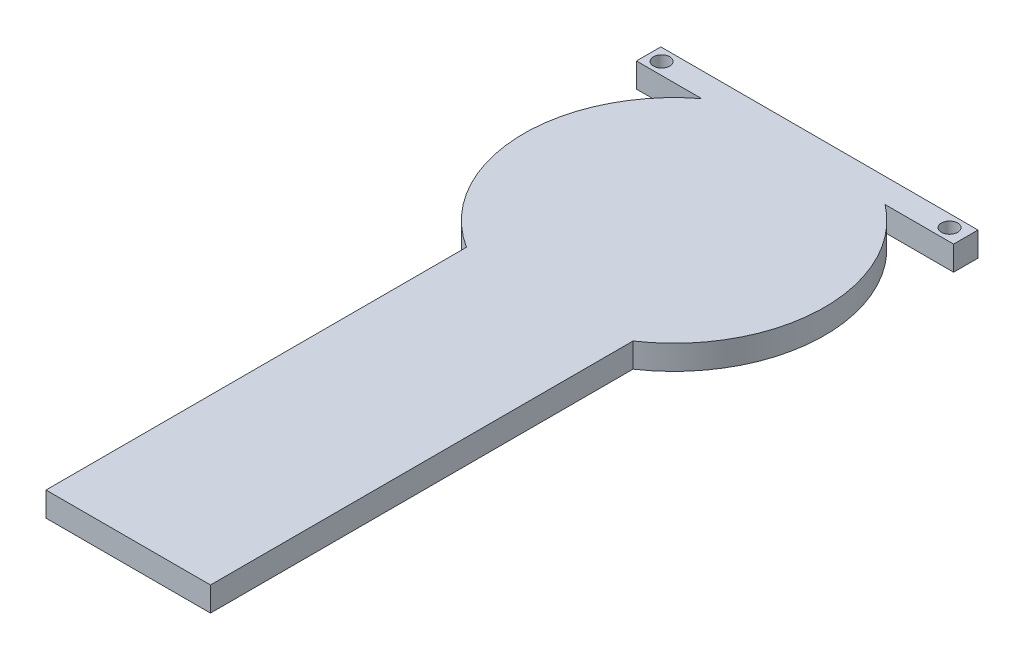
ISO-10303-21;
HEADER;
FILE_DESCRIPTION(('STEP AP214'),'2;1');
FILE_NAME('part.step','',(''),(''),'','','');
FILE_SCHEMA(('AUTOMOTIVE_DESIGN { 1 0 10303 214 1 1 1 1 }'));
ENDSEC;
DATA;
#1=APPLICATION_CONTEXT('core data for automotive mechanical design processes');
#2=APPLICATION_PROTOCOL_DEFINITION('international standard','automotive_design',2000,#1);
#3=PRODUCT_CONTEXT('',#1,'mechanical');
#4=PRODUCT('Part','Part','',(#3));
#5=PRODUCT_RELATED_PRODUCT_CATEGORY('part','',(#4));
#6=PRODUCT_DEFINITION_FORMATION('','',#4);
#7=PRODUCT_DEFINITION_CONTEXT('part definition',#1,'design');
#8=PRODUCT_DEFINITION('design','',#6,#7);
#9=PRODUCT_DEFINITION_SHAPE('','',#8);
#10=(LENGTH_UNIT() NAMED_UNIT(*) SI_UNIT(.MILLI.,.METRE.));
#11=(NAMED_UNIT(*) PLANE_ANGLE_UNIT() SI_UNIT($,.RADIAN.));
#12=(NAMED_UNIT(*) SI_UNIT($,.STERADIAN.) SOLID_ANGLE_UNIT());
#13=UNCERTAINTY_MEASURE_WITH_UNIT(LENGTH_MEASURE(1.E-05),#10,'distance_accuracy_value','');
#14=(GEOMETRIC_REPRESENTATION_CONTEXT(3) GLOBAL_UNCERTAINTY_ASSIGNED_CONTEXT((#13)) GLOBAL_UNIT_ASSIGNED_CONTEXT((#10,
#11,#12)) REPRESENTATION_CONTEXT('',''));
#15=CARTESIAN_POINT('',(0.,0.,0.));
#16=DIRECTION('',(0.,0.,1.));
#17=DIRECTION('',(1.,0.,0.));
#18=AXIS2_PLACEMENT_3D('',#15,#16,#17);
#19=CARTESIAN_POINT('',(0.,3.,0.));
#20=DIRECTION('',(0.,-1.,0.));
#21=DIRECTION('',(0.,0.,-1.));
#22=AXIS2_PLACEMENT_3D('',#19,#20,#21);
#23=CYLINDRICAL_SURFACE('',#22,18.5);
#24=CARTESIAN_POINT('',(0.,3.,0.));
#25=DIRECTION('',(0.,1.,0.));
#26=DIRECTION('',(0.,0.,1.));
#27=AXIS2_PLACEMENT_3D('',#24,#25,#26);
#28=CIRCLE('',#27,18.5);
#29=CARTESIAN_POINT('',(-11.2792597492058,3.,-14.6638432721421));
#30=VERTEX_POINT('',#29);
#31=CARTESIAN_POINT('',(-9.91173040861088,3.,15.6207426298182));
#32=VERTEX_POINT('',#31);
#33=EDGE_CURVE('E56',#30,#32,#28,.T.);
#34=ORIENTED_EDGE('',*,*,#33,.F.);
#35=DIRECTION('',(0.,-1.,0.));
#36=VECTOR('',#35,1.);
#37=CARTESIAN_POINT('',(-11.2792597492058,3.,-14.6638432721421));
#38=LINE('',#37,#36);
#39=CARTESIAN_POINT('',(-11.2792597492058,0.,-14.6638432721421));
#40=VERTEX_POINT('',#39);
#41=EDGE_CURVE('E223',#30,#40,#38,.T.);
#42=ORIENTED_EDGE('',*,*,#41,.T.);
#43=CARTESIAN_POINT('',(0.,0.,0.));
#44=DIRECTION('',(0.,1.,0.));
#45=DIRECTION('',(0.,0.,1.));
#46=AXIS2_PLACEMENT_3D('',#43,#44,#45);
#47=CIRCLE('',#46,18.5);
#48=CARTESIAN_POINT('',(-9.91173040861088,0.,15.6207426298182));
#49=VERTEX_POINT('',#48);
#50=EDGE_CURVE('E238',#40,#49,#47,.T.);
#51=ORIENTED_EDGE('',*,*,#50,.T.);
#52=DIRECTION('',(0.,-1.,0.));
#53=VECTOR('',#52,1.);
#54=CARTESIAN_POINT('',(-9.91173040861088,3.,15.6207426298182));
#55=LINE('',#54,#53);
#56=EDGE_CURVE('E131',#49,#32,#55,.F.);
#57=ORIENTED_EDGE('',*,*,#56,.T.);
#58=EDGE_LOOP('',(#34,#42,#51,#57));
#59=FACE_BOUND('',#58,.T.);
#60=ADVANCED_FACE('F46',(#59),#23,.T.);
#61=CARTESIAN_POINT('',(10.3120180075458,0.,15.3594363377062));
#62=VERTEX_POINT('',#61);
#63=CARTESIAN_POINT('',(11.2792597492058,0.,-14.6638432721421));
#64=VERTEX_POINT('',#63);
#65=EDGE_CURVE('E50',#62,#64,#47,.T.);
#66=ORIENTED_EDGE('',*,*,#65,.T.);
#67=DIRECTION('',(0.,-1.,0.));
#68=VECTOR('',#67,1.);
#69=CARTESIAN_POINT('',(11.2792597492058,3.,-14.6638432721421));
#70=LINE('',#69,#68);
#71=CARTESIAN_POINT('',(11.2792597492058,3.,-14.6638432721421));
#72=VERTEX_POINT('',#71);
#73=EDGE_CURVE('E70',#64,#72,#70,.F.);
#74=ORIENTED_EDGE('',*,*,#73,.T.);
#75=CARTESIAN_POINT('',(10.3120180075458,3.,15.3594363377062));
#76=VERTEX_POINT('',#75);
#77=EDGE_CURVE('E12',#76,#72,#28,.T.);
#78=ORIENTED_EDGE('',*,*,#77,.F.);
#79=DIRECTION('',(0.,-1.,0.));
#80=VECTOR('',#79,1.);
#81=CARTESIAN_POINT('',(10.3120180075458,3.,15.3594363377062));
#82=LINE('',#81,#80);
#83=EDGE_CURVE('E231',#76,#62,#82,.T.);
#84=ORIENTED_EDGE('',*,*,#83,.T.);
#85=EDGE_LOOP('',(#66,#74,#78,#84));
#86=FACE_BOUND('',#85,.T.);
#87=ADVANCED_FACE('F48',(#86),#23,.T.);
#88=CARTESIAN_POINT('',(0.,3.,0.));
#89=DIRECTION('',(0.,1.,0.));
#90=DIRECTION('',(0.,0.,1.));
#91=AXIS2_PLACEMENT_3D('',#88,#89,#90);
#92=PLANE('',#91);
#93=CARTESIAN_POINT('',(17.7001437994675,3.,-16.1638432721421));
#94=DIRECTION('',(0.,1.,0.));
#95=DIRECTION('',(0.,0.,1.));
#96=AXIS2_PLACEMENT_3D('',#93,#94,#95);
#97=CIRCLE('',#96,1.);
#98=CARTESIAN_POINT('',(17.7001437994675,3.,-17.1638432721421));
#99=VERTEX_POINT('',#98);
#100=EDGE_CURVE('E164',#99,#99,#97,.F.);
#101=ORIENTED_EDGE('',*,*,#100,.T.);
#102=EDGE_LOOP('',(#101));
#103=FACE_BOUND('',#102,.T.);
#104=CARTESIAN_POINT('',(-17.7001437994675,3.,-16.1638432721421));
#105=DIRECTION('',(0.,1.,0.));
#106=DIRECTION('',(0.,0.,1.));
#107=AXIS2_PLACEMENT_3D('',#104,#105,#106);
#108=CIRCLE('',#107,1.);
#109=CARTESIAN_POINT('',(-17.7001437994675,3.,-17.1638432721421));
#110=VERTEX_POINT('',#109);
#111=EDGE_CURVE('E158',#110,#110,#108,.F.);
#112=ORIENTED_EDGE('',*,*,#111,.T.);
#113=EDGE_LOOP('',(#112));
#114=FACE_BOUND('',#113,.T.);
#115=DIRECTION('',(1.,0.,0.));
#116=VECTOR('',#115,1.);
#117=CARTESIAN_POINT('',(19.7001437994675,3.,-17.6638432721421));
#118=LINE('',#117,#116);
#119=CARTESIAN_POINT('',(-19.2998562005325,3.,-17.6638432721421));
#120=VERTEX_POINT('',#119);
#121=CARTESIAN_POINT('',(19.7001437994675,3.,-17.6638432721421));
#122=VERTEX_POINT('',#121);
#123=EDGE_CURVE('E190',#120,#122,#118,.T.);
#124=ORIENTED_EDGE('',*,*,#123,.F.);
#125=DIRECTION('',(0.,0.,-1.));
#126=VECTOR('',#125,1.);
#127=CARTESIAN_POINT('',(-19.2998562005325,3.,-17.6638432721421));
#128=LINE('',#127,#126);
#129=CARTESIAN_POINT('',(-19.2998562005325,3.,-14.6638432721421));
#130=VERTEX_POINT('',#129);
#131=EDGE_CURVE('E186',#130,#120,#128,.T.);
#132=ORIENTED_EDGE('',*,*,#131,.F.);
#133=DIRECTION('',(-1.,0.,0.));
#134=VECTOR('',#133,1.);
#135=CARTESIAN_POINT('',(19.7001437994675,3.,-14.6638432721421));
#136=LINE('',#135,#134);
#137=EDGE_CURVE('E180',#30,#130,#136,.T.);
#138=ORIENTED_EDGE('',*,*,#137,.F.);
#139=ORIENTED_EDGE('',*,*,#33,.T.);
#140=DIRECTION('',(0.,0.,-1.));
#141=VECTOR('',#140,1.);
#142=CARTESIAN_POINT('',(-9.91173040861088,3.,17.3200234975173));
#143=LINE('',#142,#141);
#144=CARTESIAN_POINT('',(-9.91173040861088,3.,67.3200234975173));
#145=VERTEX_POINT('',#144);
#146=EDGE_CURVE('E228',#145,#32,#143,.T.);
#147=ORIENTED_EDGE('',*,*,#146,.F.);
#148=DIRECTION('',(1.,0.,0.));
#149=VECTOR('',#148,1.);
#150=CARTESIAN_POINT('',(-9.91173040861088,3.,67.3200234975173));
#151=LINE('',#150,#149);
#152=CARTESIAN_POINT('',(10.3120180075458,3.,67.3200234975173));
#153=VERTEX_POINT('',#152);
#154=EDGE_CURVE('E144',#145,#153,#151,.T.);
#155=ORIENTED_EDGE('',*,*,#154,.T.);
#156=DIRECTION('',(0.,0.,1.));
#157=VECTOR('',#156,1.);
#158=CARTESIAN_POINT('',(10.3120180075458,3.,17.3200234975173));
#159=LINE('',#158,#157);
#160=EDGE_CURVE('E135',#76,#153,#159,.T.);
#161=ORIENTED_EDGE('',*,*,#160,.F.);
#162=ORIENTED_EDGE('',*,*,#77,.T.);
#163=CARTESIAN_POINT('',(19.7001437994675,3.,-14.6638432721421));
#164=VERTEX_POINT('',#163);
#165=EDGE_CURVE('E182',#164,#72,#136,.T.);
#166=ORIENTED_EDGE('',*,*,#165,.F.);
#167=DIRECTION('',(0.,0.,1.));
#168=VECTOR('',#167,1.);
#169=CARTESIAN_POINT('',(19.7001437994675,3.,-17.6638432721421));
#170=LINE('',#169,#168);
#171=EDGE_CURVE('E176',#122,#164,#170,.T.);
#172=ORIENTED_EDGE('',*,*,#171,.F.);
#173=EDGE_LOOP('',(#124,#132,#138,#139,#147,#155,#161,#162,#166,#172));
#174=FACE_BOUND('',#173,.T.);
#175=ADVANCED_FACE('F244',(#103,#114,#174),#92,.T.);
#176=CARTESIAN_POINT('',(0.,0.,0.));
#177=DIRECTION('',(0.,1.,0.));
#178=DIRECTION('',(0.,0.,1.));
#179=AXIS2_PLACEMENT_3D('',#176,#177,#178);
#180=PLANE('',#179);
#181=CARTESIAN_POINT('',(17.7001437994675,0.,-16.1638432721421));
#182=DIRECTION('',(0.,-1.,0.));
#183=DIRECTION('',(0.,0.,-1.));
#184=AXIS2_PLACEMENT_3D('',#181,#182,#183);
#185=CIRCLE('',#184,1.);
#186=CARTESIAN_POINT('',(17.7001437994675,0.,-17.1638432721421));
#187=VERTEX_POINT('',#186);
#188=EDGE_CURVE('E160',#187,#187,#185,.T.);
#189=ORIENTED_EDGE('',*,*,#188,.F.);
#190=EDGE_LOOP('',(#189));
#191=FACE_BOUND('',#190,.T.);
#192=CARTESIAN_POINT('',(-17.7001437994675,0.,-16.1638432721421));
#193=DIRECTION('',(0.,-1.,0.));
#194=DIRECTION('',(0.,0.,1.));
#195=AXIS2_PLACEMENT_3D('',#192,#193,#194);
#196=CIRCLE('',#195,1.);
#197=CARTESIAN_POINT('',(-17.7001437994675,0.,-17.1638432721421));
#198=VERTEX_POINT('',#197);
#199=EDGE_CURVE('E165',#198,#198,#196,.T.);
#200=ORIENTED_EDGE('',*,*,#199,.F.);
#201=EDGE_LOOP('',(#200));
#202=FACE_BOUND('',#201,.T.);
#203=DIRECTION('',(0.,0.,-1.));
#204=VECTOR('',#203,1.);
#205=CARTESIAN_POINT('',(-19.2998562005325,0.,-17.6638432721421));
#206=LINE('',#205,#204);
#207=CARTESIAN_POINT('',(-19.2998562005325,0.,-14.6638432721421));
#208=VERTEX_POINT('',#207);
#209=CARTESIAN_POINT('',(-19.2998562005325,0.,-17.6638432721421));
#210=VERTEX_POINT('',#209);
#211=EDGE_CURVE('E202',#208,#210,#206,.T.);
#212=ORIENTED_EDGE('',*,*,#211,.T.);
#213=DIRECTION('',(1.,0.,0.));
#214=VECTOR('',#213,1.);
#215=CARTESIAN_POINT('',(19.7001437994675,0.,-17.6638432721421));
#216=LINE('',#215,#214);
#217=CARTESIAN_POINT('',(19.7001437994675,0.,-17.6638432721421));
#218=VERTEX_POINT('',#217);
#219=EDGE_CURVE('E181',#210,#218,#216,.T.);
#220=ORIENTED_EDGE('',*,*,#219,.T.);
#221=DIRECTION('',(0.,0.,1.));
#222=VECTOR('',#221,1.);
#223=CARTESIAN_POINT('',(19.7001437994675,0.,-17.6638432721421));
#224=LINE('',#223,#222);
#225=CARTESIAN_POINT('',(19.7001437994675,0.,-14.6638432721421));
#226=VERTEX_POINT('',#225);
#227=EDGE_CURVE('E169',#218,#226,#224,.T.);
#228=ORIENTED_EDGE('',*,*,#227,.T.);
#229=DIRECTION('',(-1.,0.,0.));
#230=VECTOR('',#229,1.);
#231=CARTESIAN_POINT('',(19.7001437994675,0.,-14.6638432721421));
#232=LINE('',#231,#230);
#233=EDGE_CURVE('E198',#226,#64,#232,.T.);
#234=ORIENTED_EDGE('',*,*,#233,.T.);
#235=ORIENTED_EDGE('',*,*,#65,.F.);
#236=DIRECTION('',(0.,0.,1.));
#237=VECTOR('',#236,1.);
#238=CARTESIAN_POINT('',(10.3120180075458,0.,17.3200234975173));
#239=LINE('',#238,#237);
#240=CARTESIAN_POINT('',(10.3120180075458,0.,67.3200234975173));
#241=VERTEX_POINT('',#240);
#242=EDGE_CURVE('E136',#62,#241,#239,.T.);
#243=ORIENTED_EDGE('',*,*,#242,.T.);
#244=DIRECTION('',(1.,0.,0.));
#245=VECTOR('',#244,1.);
#246=CARTESIAN_POINT('',(-9.91173040861088,0.,67.3200234975173));
#247=LINE('',#246,#245);
#248=CARTESIAN_POINT('',(-9.91173040861088,0.,67.3200234975173));
#249=VERTEX_POINT('',#248);
#250=EDGE_CURVE('E142',#249,#241,#247,.T.);
#251=ORIENTED_EDGE('',*,*,#250,.F.);
#252=DIRECTION('',(0.,0.,-1.));
#253=VECTOR('',#252,1.);
#254=CARTESIAN_POINT('',(-9.91173040861088,0.,17.3200234975173));
#255=LINE('',#254,#253);
#256=EDGE_CURVE('E125',#249,#49,#255,.T.);
#257=ORIENTED_EDGE('',*,*,#256,.T.);
#258=ORIENTED_EDGE('',*,*,#50,.F.);
#259=EDGE_CURVE('E197',#40,#208,#232,.T.);
#260=ORIENTED_EDGE('',*,*,#259,.T.);
#261=EDGE_LOOP('',(#212,#220,#228,#234,#235,#243,#251,#257,#258,#260));
#262=FACE_BOUND('',#261,.T.);
#263=ADVANCED_FACE('F149',(#191,#202,#262),#180,.F.);
#264=CARTESIAN_POINT('',(-9.91173040861088,3.,17.3200234975173));
#265=DIRECTION('',(-1.,0.,0.));
#266=DIRECTION('',(0.,0.,1.));
#267=AXIS2_PLACEMENT_3D('',#264,#265,#266);
#268=PLANE('',#267);
#269=ORIENTED_EDGE('',*,*,#56,.F.);
#270=ORIENTED_EDGE('',*,*,#256,.F.);
#271=DIRECTION('',(0.,1.,0.));
#272=VECTOR('',#271,1.);
#273=CARTESIAN_POINT('',(-9.91173040861088,0.,67.3200234975173));
#274=LINE('',#273,#272);
#275=EDGE_CURVE('E129',#249,#145,#274,.T.);
#276=ORIENTED_EDGE('',*,*,#275,.T.);
#277=ORIENTED_EDGE('',*,*,#146,.T.);
#278=EDGE_LOOP('',(#269,#270,#276,#277));
#279=FACE_BOUND('',#278,.T.);
#280=ADVANCED_FACE('F127',(#279),#268,.T.);
#281=CARTESIAN_POINT('',(10.3120180075458,3.,17.3200234975173));
#282=DIRECTION('',(1.,0.,0.));
#283=DIRECTION('',(0.,0.,-1.));
#284=AXIS2_PLACEMENT_3D('',#281,#282,#283);
#285=PLANE('',#284);
#286=ORIENTED_EDGE('',*,*,#242,.F.);
#287=ORIENTED_EDGE('',*,*,#83,.F.);
#288=ORIENTED_EDGE('',*,*,#160,.T.);
#289=DIRECTION('',(0.,1.,0.));
#290=VECTOR('',#289,1.);
#291=CARTESIAN_POINT('',(10.3120180075458,0.,67.3200234975173));
#292=LINE('',#291,#290);
#293=EDGE_CURVE('E146',#241,#153,#292,.T.);
#294=ORIENTED_EDGE('',*,*,#293,.F.);
#295=EDGE_LOOP('',(#286,#287,#288,#294));
#296=FACE_BOUND('',#295,.T.);
#297=ADVANCED_FACE('F270',(#296),#285,.T.);
#298=CARTESIAN_POINT('',(-19.2998562005325,3.,-17.6638432721421));
#299=DIRECTION('',(-1.,0.,0.));
#300=DIRECTION('',(0.,0.,1.));
#301=AXIS2_PLACEMENT_3D('',#298,#299,#300);
#302=PLANE('',#301);
#303=ORIENTED_EDGE('',*,*,#211,.F.);
#304=DIRECTION('',(0.,-1.,0.));
#305=VECTOR('',#304,1.);
#306=CARTESIAN_POINT('',(-19.2998562005325,3.,-14.6638432721421));
#307=LINE('',#306,#305);
#308=EDGE_CURVE('E215',#130,#208,#307,.T.);
#309=ORIENTED_EDGE('',*,*,#308,.F.);
#310=ORIENTED_EDGE('',*,*,#131,.T.);
#311=DIRECTION('',(0.,-1.,0.));
#312=VECTOR('',#311,1.);
#313=CARTESIAN_POINT('',(-19.2998562005325,3.,-17.6638432721421));
#314=LINE('',#313,#312);
#315=EDGE_CURVE('E211',#120,#210,#314,.T.);
#316=ORIENTED_EDGE('',*,*,#315,.T.);
#317=EDGE_LOOP('',(#303,#309,#310,#316));
#318=FACE_BOUND('',#317,.T.);
#319=ADVANCED_FACE('F254',(#318),#302,.T.);
#320=CARTESIAN_POINT('',(19.7001437994675,3.,-14.6638432721421));
#321=DIRECTION('',(0.,0.,1.));
#322=DIRECTION('',(1.,0.,0.));
#323=AXIS2_PLACEMENT_3D('',#320,#321,#322);
#324=PLANE('',#323);
#325=ORIENTED_EDGE('',*,*,#41,.F.);
#326=ORIENTED_EDGE('',*,*,#137,.T.);
#327=ORIENTED_EDGE('',*,*,#308,.T.);
#328=ORIENTED_EDGE('',*,*,#259,.F.);
#329=EDGE_LOOP('',(#325,#326,#327,#328));
#330=FACE_BOUND('',#329,.T.);
#331=ADVANCED_FACE('F252',(#330),#324,.T.);
#332=CARTESIAN_POINT('',(19.7001437994675,3.,-17.6638432721421));
#333=DIRECTION('',(0.,0.,-1.));
#334=DIRECTION('',(-1.,0.,0.));
#335=AXIS2_PLACEMENT_3D('',#332,#333,#334);
#336=PLANE('',#335);
#337=ORIENTED_EDGE('',*,*,#219,.F.);
#338=ORIENTED_EDGE('',*,*,#315,.F.);
#339=ORIENTED_EDGE('',*,*,#123,.T.);
#340=DIRECTION('',(0.,-1.,0.));
#341=VECTOR('',#340,1.);
#342=CARTESIAN_POINT('',(19.7001437994675,3.,-17.6638432721421));
#343=LINE('',#342,#341);
#344=EDGE_CURVE('E207',#122,#218,#343,.T.);
#345=ORIENTED_EDGE('',*,*,#344,.T.);
#346=EDGE_LOOP('',(#337,#338,#339,#345));
#347=FACE_BOUND('',#346,.T.);
#348=ADVANCED_FACE('F257',(#347),#336,.T.);
#349=ORIENTED_EDGE('',*,*,#73,.F.);
#350=ORIENTED_EDGE('',*,*,#233,.F.);
#351=DIRECTION('',(0.,-1.,0.));
#352=VECTOR('',#351,1.);
#353=CARTESIAN_POINT('',(19.7001437994675,3.,-14.6638432721421));
#354=LINE('',#353,#352);
#355=EDGE_CURVE('E193',#164,#226,#354,.T.);
#356=ORIENTED_EDGE('',*,*,#355,.F.);
#357=ORIENTED_EDGE('',*,*,#165,.T.);
#358=EDGE_LOOP('',(#349,#350,#356,#357));
#359=FACE_BOUND('',#358,.T.);
#360=ADVANCED_FACE('F266',(#359),#324,.T.);
#361=CARTESIAN_POINT('',(19.7001437994675,3.,-17.6638432721421));
#362=DIRECTION('',(1.,0.,0.));
#363=DIRECTION('',(0.,0.,-1.));
#364=AXIS2_PLACEMENT_3D('',#361,#362,#363);
#365=PLANE('',#364);
#366=ORIENTED_EDGE('',*,*,#227,.F.);
#367=ORIENTED_EDGE('',*,*,#344,.F.);
#368=ORIENTED_EDGE('',*,*,#171,.T.);
#369=ORIENTED_EDGE('',*,*,#355,.T.);
#370=EDGE_LOOP('',(#366,#367,#368,#369));
#371=FACE_BOUND('',#370,.T.);
#372=ADVANCED_FACE('F262',(#371),#365,.T.);
#373=CARTESIAN_POINT('',(-17.7001437994675,5.82842712474619,-16.1638432721421));
#374=DIRECTION('',(0.,-1.,0.));
#375=DIRECTION('',(0.,0.,-1.));
#376=AXIS2_PLACEMENT_3D('',#373,#374,#375);
#377=CYLINDRICAL_SURFACE('',#376,1.);
#378=CARTESIAN_POINT('',(-17.7001437994675,0.,-17.1638432721421));
#379=CARTESIAN_POINT('',(-17.7001437994675,0.03125,-17.1638432721421));
#380=CARTESIAN_POINT('',(-17.7001437994675,0.0625000000000001,-17.1638432721421));
#381=CARTESIAN_POINT('',(-17.7001437994675,0.125,-17.1638432721421));
#382=CARTESIAN_POINT('',(-17.7001437994675,0.15625,-17.1638432721421));
#383=CARTESIAN_POINT('',(-17.7001437994675,0.21875,-17.1638432721421));
#384=CARTESIAN_POINT('',(-17.7001437994675,0.25,-17.1638432721421));
#385=CARTESIAN_POINT('',(-17.7001437994675,0.3125,-17.1638432721421));
#386=CARTESIAN_POINT('',(-17.7001437994675,0.34375,-17.1638432721421));
#387=CARTESIAN_POINT('',(-17.7001437994675,0.40625,-17.1638432721421));
#388=CARTESIAN_POINT('',(-17.7001437994675,0.4375,-17.1638432721421));
#389=CARTESIAN_POINT('',(-17.7001437994675,0.5,-17.1638432721421));
#390=CARTESIAN_POINT('',(-17.7001437994675,0.53125,-17.1638432721421));
#391=CARTESIAN_POINT('',(-17.7001437994675,0.59375,-17.1638432721421));
#392=CARTESIAN_POINT('',(-17.7001437994675,0.625,-17.1638432721421));
#393=CARTESIAN_POINT('',(-17.7001437994675,0.6875,-17.1638432721421));
#394=CARTESIAN_POINT('',(-17.7001437994675,0.71875,-17.1638432721421));
#395=CARTESIAN_POINT('',(-17.7001437994675,0.78125,-17.1638432721421));
#396=CARTESIAN_POINT('',(-17.7001437994675,0.8125,-17.1638432721421));
#397=CARTESIAN_POINT('',(-17.7001437994675,0.875,-17.1638432721421));
#398=CARTESIAN_POINT('',(-17.7001437994675,0.90625,-17.1638432721421));
#399=CARTESIAN_POINT('',(-17.7001437994675,0.96875,-17.1638432721421));
#400=CARTESIAN_POINT('',(-17.7001437994675,1.,-17.1638432721421));
#401=CARTESIAN_POINT('',(-17.7001437994675,1.0625,-17.1638432721421));
#402=CARTESIAN_POINT('',(-17.7001437994675,1.09375,-17.1638432721421));
#403=CARTESIAN_POINT('',(-17.7001437994675,1.15625,-17.1638432721421));
#404=CARTESIAN_POINT('',(-17.7001437994675,1.1875,-17.1638432721421));
#405=CARTESIAN_POINT('',(-17.7001437994675,1.25,-17.1638432721421));
#406=CARTESIAN_POINT('',(-17.7001437994675,1.28125,-17.1638432721421));
#407=CARTESIAN_POINT('',(-17.7001437994675,1.34375,-17.1638432721421));
#408=CARTESIAN_POINT('',(-17.7001437994675,1.375,-17.1638432721421));
#409=CARTESIAN_POINT('',(-17.7001437994675,1.4375,-17.1638432721421));
#410=CARTESIAN_POINT('',(-17.7001437994675,1.46875,-17.1638432721421));
#411=CARTESIAN_POINT('',(-17.7001437994675,1.53125,-17.1638432721421));
#412=CARTESIAN_POINT('',(-17.7001437994675,1.5625,-17.1638432721421));
#413=CARTESIAN_POINT('',(-17.7001437994675,1.625,-17.1638432721421));
#414=CARTESIAN_POINT('',(-17.7001437994675,1.65625,-17.1638432721421));
#415=CARTESIAN_POINT('',(-17.7001437994675,1.71875,-17.1638432721421));
#416=CARTESIAN_POINT('',(-17.7001437994675,1.75,-17.1638432721421));
#417=CARTESIAN_POINT('',(-17.7001437994675,1.8125,-17.1638432721421));
#418=CARTESIAN_POINT('',(-17.7001437994675,1.84375,-17.1638432721421));
#419=CARTESIAN_POINT('',(-17.7001437994675,1.90625,-17.1638432721421));
#420=CARTESIAN_POINT('',(-17.7001437994675,1.9375,-17.1638432721421));
#421=CARTESIAN_POINT('',(-17.7001437994675,2.,-17.1638432721421));
#422=CARTESIAN_POINT('',(-17.7001437994675,2.03125,-17.1638432721421));
#423=CARTESIAN_POINT('',(-17.7001437994675,2.09375,-17.1638432721421));
#424=CARTESIAN_POINT('',(-17.7001437994675,2.125,-17.1638432721421));
#425=CARTESIAN_POINT('',(-17.7001437994675,2.1875,-17.1638432721421));
#426=CARTESIAN_POINT('',(-17.7001437994675,2.21875,-17.1638432721421));
#427=CARTESIAN_POINT('',(-17.7001437994675,2.28125,-17.1638432721421));
#428=CARTESIAN_POINT('',(-17.7001437994675,2.3125,-17.1638432721421));
#429=CARTESIAN_POINT('',(-17.7001437994675,2.375,-17.1638432721421));
#430=CARTESIAN_POINT('',(-17.7001437994675,2.40625,-17.1638432721421));
#431=CARTESIAN_POINT('',(-17.7001437994675,2.46875,-17.1638432721421));
#432=CARTESIAN_POINT('',(-17.7001437994675,2.5,-17.1638432721421));
#433=CARTESIAN_POINT('',(-17.7001437994675,2.5625,-17.1638432721421));
#434=CARTESIAN_POINT('',(-17.7001437994675,2.59375,-17.1638432721421));
#435=CARTESIAN_POINT('',(-17.7001437994675,2.65625,-17.1638432721421));
#436=CARTESIAN_POINT('',(-17.7001437994675,2.6875,-17.1638432721421));
#437=CARTESIAN_POINT('',(-17.7001437994675,2.75,-17.1638432721421));
#438=CARTESIAN_POINT('',(-17.7001437994675,2.78125,-17.1638432721421));
#439=CARTESIAN_POINT('',(-17.7001437994675,2.84375,-17.1638432721421));
#440=CARTESIAN_POINT('',(-17.7001437994675,2.875,-17.1638432721421));
#441=CARTESIAN_POINT('',(-17.7001437994675,2.9375,-17.1638432721421));
#442=CARTESIAN_POINT('',(-17.7001437994675,2.96875,-17.1638432721421));
#443=CARTESIAN_POINT('',(-17.7001437994675,3.,-17.1638432721421));
#444=B_SPLINE_CURVE_WITH_KNOTS('',3,(#378,#379,#380,#381,#382,#383,#384,#385,#386,#387,#388,
#389,#390,#391,#392,#393,#394,#395,#396,#397,#398,#399,#400,#401,#402,#403,#404,#405,#406,#407,
#408,#409,#410,#411,#412,#413,#414,#415,#416,#417,#418,#419,#420,#421,#422,#423,#424,#425,#426,
#427,#428,#429,#430,#431,#432,#433,#434,#435,#436,#437,#438,#439,#440,#441,#442,#443),
.UNSPECIFIED.,.F.,.F.,(4,2,2,2,2,2,2,2,2,2,2,2,2,2,2,2,2,2,2,2,2,2,2,2,2,2,2,2,2,2,2,2,4),(0.,
0.0937500000000001,0.1875,0.28125,0.375,0.46875,0.5625,0.65625,0.75,0.84375,0.9375,1.03125,
1.125,1.21875,1.3125,1.40625,1.5,1.59375,1.6875,1.78125,1.875,1.96875,2.0625,2.15625,2.25,
2.34375,2.4375,2.53125,2.625,2.71875,2.8125,2.90625,3.),.UNSPECIFIED.);
#445=EDGE_CURVE('BSEAM298',#198,#110,#444,.T.);
#446=ORIENTED_EDGE('',*,*,#199,.T.);
#447=ORIENTED_EDGE('',*,*,#111,.F.);
#448=ORIENTED_EDGE('',*,*,#445,.T.);
#449=ORIENTED_EDGE('',*,*,#445,.F.);
#450=EDGE_LOOP('',(#446,#448,#447,#449));
#451=FACE_BOUND('',#450,.T.);
#452=ADVANCED_FACE('F298',(#451),#377,.F.);
#453=CARTESIAN_POINT('',(17.7001437994675,5.82842712474619,-16.1638432721421));
#454=DIRECTION('',(0.,-1.,0.));
#455=DIRECTION('',(0.,0.,-1.));
#456=AXIS2_PLACEMENT_3D('',#453,#454,#455);
#457=CYLINDRICAL_SURFACE('',#456,1.);
#458=CARTESIAN_POINT('',(17.7001437994675,0.,-17.1638432721421));
#459=CARTESIAN_POINT('',(17.7001437994675,0.03125,-17.1638432721421));
#460=CARTESIAN_POINT('',(17.7001437994675,0.0625000000000001,-17.1638432721421));
#461=CARTESIAN_POINT('',(17.7001437994675,0.125,-17.1638432721421));
#462=CARTESIAN_POINT('',(17.7001437994675,0.15625,-17.1638432721421));
#463=CARTESIAN_POINT('',(17.7001437994675,0.21875,-17.1638432721421));
#464=CARTESIAN_POINT('',(17.7001437994675,0.25,-17.1638432721421));
#465=CARTESIAN_POINT('',(17.7001437994675,0.3125,-17.1638432721421));
#466=CARTESIAN_POINT('',(17.7001437994675,0.34375,-17.1638432721421));
#467=CARTESIAN_POINT('',(17.7001437994675,0.40625,-17.1638432721421));
#468=CARTESIAN_POINT('',(17.7001437994675,0.4375,-17.1638432721421));
#469=CARTESIAN_POINT('',(17.7001437994675,0.5,-17.1638432721421));
#470=CARTESIAN_POINT('',(17.7001437994675,0.53125,-17.1638432721421));
#471=CARTESIAN_POINT('',(17.7001437994675,0.59375,-17.1638432721421));
#472=CARTESIAN_POINT('',(17.7001437994675,0.625,-17.1638432721421));
#473=CARTESIAN_POINT('',(17.7001437994675,0.6875,-17.1638432721421));
#474=CARTESIAN_POINT('',(17.7001437994675,0.71875,-17.1638432721421));
#475=CARTESIAN_POINT('',(17.7001437994675,0.78125,-17.1638432721421));
#476=CARTESIAN_POINT('',(17.7001437994675,0.8125,-17.1638432721421));
#477=CARTESIAN_POINT('',(17.7001437994675,0.875,-17.1638432721421));
#478=CARTESIAN_POINT('',(17.7001437994675,0.90625,-17.1638432721421));
#479=CARTESIAN_POINT('',(17.7001437994675,0.96875,-17.1638432721421));
#480=CARTESIAN_POINT('',(17.7001437994675,1.,-17.1638432721421));
#481=CARTESIAN_POINT('',(17.7001437994675,1.0625,-17.1638432721421));
#482=CARTESIAN_POINT('',(17.7001437994675,1.09375,-17.1638432721421));
#483=CARTESIAN_POINT('',(17.7001437994675,1.15625,-17.1638432721421));
#484=CARTESIAN_POINT('',(17.7001437994675,1.1875,-17.1638432721421));
#485=CARTESIAN_POINT('',(17.7001437994675,1.25,-17.1638432721421));
#486=CARTESIAN_POINT('',(17.7001437994675,1.28125,-17.1638432721421));
#487=CARTESIAN_POINT('',(17.7001437994675,1.34375,-17.1638432721421));
#488=CARTESIAN_POINT('',(17.7001437994675,1.375,-17.1638432721421));
#489=CARTESIAN_POINT('',(17.7001437994675,1.4375,-17.1638432721421));
#490=CARTESIAN_POINT('',(17.7001437994675,1.46875,-17.1638432721421));
#491=CARTESIAN_POINT('',(17.7001437994675,1.53125,-17.1638432721421));
#492=CARTESIAN_POINT('',(17.7001437994675,1.5625,-17.1638432721421));
#493=CARTESIAN_POINT('',(17.7001437994675,1.625,-17.1638432721421));
#494=CARTESIAN_POINT('',(17.7001437994675,1.65625,-17.1638432721421));
#495=CARTESIAN_POINT('',(17.7001437994675,1.71875,-17.1638432721421));
#496=CARTESIAN_POINT('',(17.7001437994675,1.75,-17.1638432721421));
#497=CARTESIAN_POINT('',(17.7001437994675,1.8125,-17.1638432721421));
#498=CARTESIAN_POINT('',(17.7001437994675,1.84375,-17.1638432721421));
#499=CARTESIAN_POINT('',(17.7001437994675,1.90625,-17.1638432721421));
#500=CARTESIAN_POINT('',(17.7001437994675,1.9375,-17.1638432721421));
#501=CARTESIAN_POINT('',(17.7001437994675,2.,-17.1638432721421));
#502=CARTESIAN_POINT('',(17.7001437994675,2.03125,-17.1638432721421));
#503=CARTESIAN_POINT('',(17.7001437994675,2.09375,-17.1638432721421));
#504=CARTESIAN_POINT('',(17.7001437994675,2.125,-17.1638432721421));
#505=CARTESIAN_POINT('',(17.7001437994675,2.1875,-17.1638432721421));
#506=CARTESIAN_POINT('',(17.7001437994675,2.21875,-17.1638432721421));
#507=CARTESIAN_POINT('',(17.7001437994675,2.28125,-17.1638432721421));
#508=CARTESIAN_POINT('',(17.7001437994675,2.3125,-17.1638432721421));
#509=CARTESIAN_POINT('',(17.7001437994675,2.375,-17.1638432721421));
#510=CARTESIAN_POINT('',(17.7001437994675,2.40625,-17.1638432721421));
#511=CARTESIAN_POINT('',(17.7001437994675,2.46875,-17.1638432721421));
#512=CARTESIAN_POINT('',(17.7001437994675,2.5,-17.1638432721421));
#513=CARTESIAN_POINT('',(17.7001437994675,2.5625,-17.1638432721421));
#514=CARTESIAN_POINT('',(17.7001437994675,2.59375,-17.1638432721421));
#515=CARTESIAN_POINT('',(17.7001437994675,2.65625,-17.1638432721421));
#516=CARTESIAN_POINT('',(17.7001437994675,2.6875,-17.1638432721421));
#517=CARTESIAN_POINT('',(17.7001437994675,2.75,-17.1638432721421));
#518=CARTESIAN_POINT('',(17.7001437994675,2.78125,-17.1638432721421));
#519=CARTESIAN_POINT('',(17.7001437994675,2.84375,-17.1638432721421));
#520=CARTESIAN_POINT('',(17.7001437994675,2.875,-17.1638432721421));
#521=CARTESIAN_POINT('',(17.7001437994675,2.9375,-17.1638432721421));
#522=CARTESIAN_POINT('',(17.7001437994675,2.96875,-17.1638432721421));
#523=CARTESIAN_POINT('',(17.7001437994675,3.,-17.1638432721421));
#524=B_SPLINE_CURVE_WITH_KNOTS('',3,(#458,#459,#460,#461,#462,#463,#464,#465,#466,#467,#468,
#469,#470,#471,#472,#473,#474,#475,#476,#477,#478,#479,#480,#481,#482,#483,#484,#485,#486,#487,
#488,#489,#490,#491,#492,#493,#494,#495,#496,#497,#498,#499,#500,#501,#502,#503,#504,#505,#506,
#507,#508,#509,#510,#511,#512,#513,#514,#515,#516,#517,#518,#519,#520,#521,#522,#523),
.UNSPECIFIED.,.F.,.F.,(4,2,2,2,2,2,2,2,2,2,2,2,2,2,2,2,2,2,2,2,2,2,2,2,2,2,2,2,2,2,2,2,4),(0.,
0.0937500000000001,0.1875,0.28125,0.375,0.46875,0.5625,0.65625,0.75,0.84375,0.9375,1.03125,
1.125,1.21875,1.3125,1.40625,1.5,1.59375,1.6875,1.78125,1.875,1.96875,2.0625,2.15625,2.25,
2.34375,2.4375,2.53125,2.625,2.71875,2.8125,2.90625,3.),.UNSPECIFIED.);
#525=EDGE_CURVE('BSEAM300',#187,#99,#524,.T.);
#526=ORIENTED_EDGE('',*,*,#188,.T.);
#527=ORIENTED_EDGE('',*,*,#100,.F.);
#528=ORIENTED_EDGE('',*,*,#525,.T.);
#529=ORIENTED_EDGE('',*,*,#525,.F.);
#530=EDGE_LOOP('',(#526,#528,#527,#529));
#531=FACE_BOUND('',#530,.T.);
#532=ADVANCED_FACE('F300',(#531),#457,.F.);
#533=CARTESIAN_POINT('',(-9.91173040861088,0.,67.3200234975173));
#534=DIRECTION('',(0.,0.,1.));
#535=DIRECTION('',(1.,0.,0.));
#536=AXIS2_PLACEMENT_3D('',#533,#534,#535);
#537=PLANE('',#536);
#538=ORIENTED_EDGE('',*,*,#154,.F.);
#539=ORIENTED_EDGE('',*,*,#275,.F.);
#540=ORIENTED_EDGE('',*,*,#250,.T.);
#541=ORIENTED_EDGE('',*,*,#293,.T.);
#542=EDGE_LOOP('',(#538,#539,#540,#541));
#543=FACE_BOUND('',#542,.T.);
#544=ADVANCED_FACE('F140',(#543),#537,.T.);
#545=CLOSED_SHELL('',(#60,#87,#175,#263,#280,#297,#319,#331,#348,#360,#372,#452,#532,#544));
#546=MANIFOLD_SOLID_BREP('B2',#545);
#547=ADVANCED_BREP_SHAPE_REPRESENTATION('',(#18,#546),#14);
#548=SHAPE_DEFINITION_REPRESENTATION(#9,#547);
ENDSEC;
END-ISO-10303-21;
